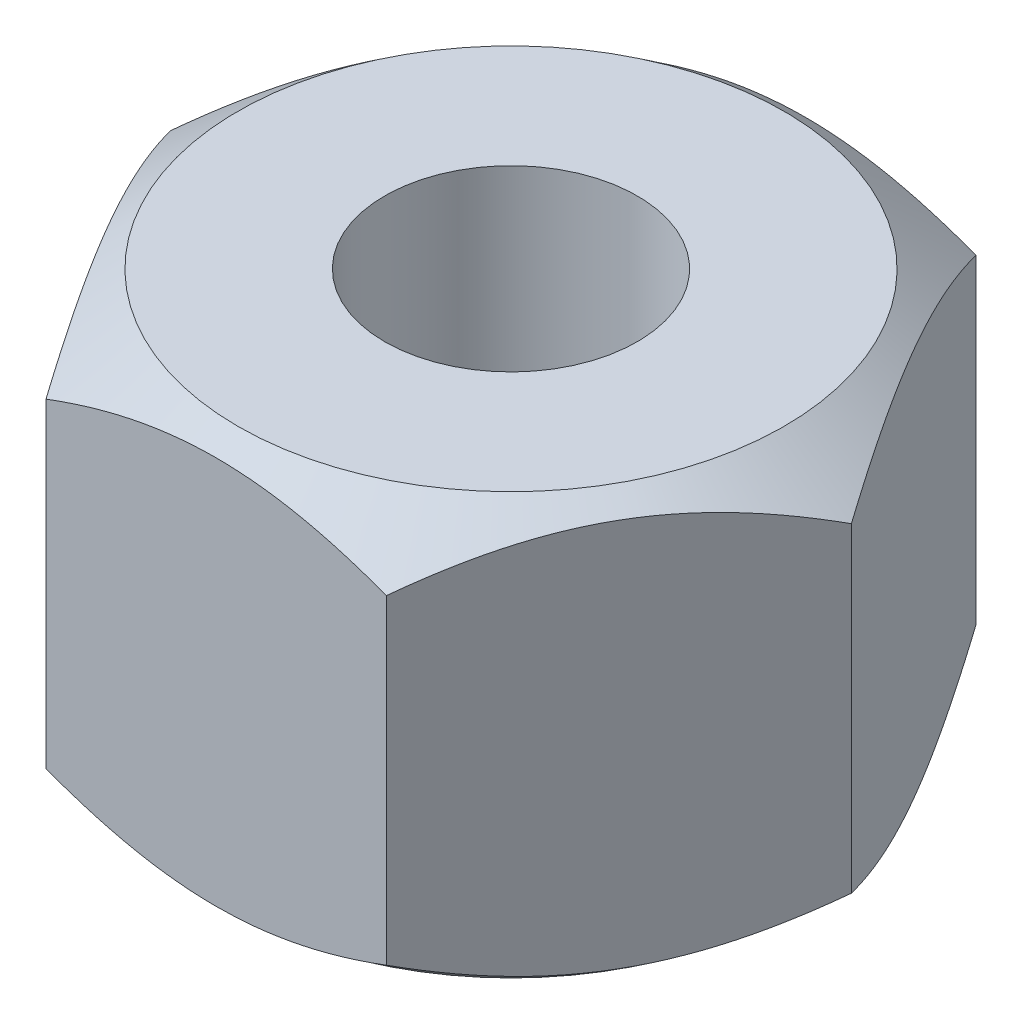
ISO-10303-21;
HEADER;
FILE_DESCRIPTION(('STEP AP214'),'2;1');
FILE_NAME('part.step','',(''),(''),'','','');
FILE_SCHEMA(('AUTOMOTIVE_DESIGN { 1 0 10303 214 1 1 1 1 }'));
ENDSEC;
DATA;
#1=APPLICATION_CONTEXT('core data for automotive mechanical design processes');
#2=APPLICATION_PROTOCOL_DEFINITION('international standard','automotive_design',2000,#1);
#3=PRODUCT_CONTEXT('',#1,'mechanical');
#4=PRODUCT('Part','Part','',(#3));
#5=PRODUCT_RELATED_PRODUCT_CATEGORY('part','',(#4));
#6=PRODUCT_DEFINITION_FORMATION('','',#4);
#7=PRODUCT_DEFINITION_CONTEXT('part definition',#1,'design');
#8=PRODUCT_DEFINITION('design','',#6,#7);
#9=PRODUCT_DEFINITION_SHAPE('','',#8);
#10=(LENGTH_UNIT() NAMED_UNIT(*) SI_UNIT(.MILLI.,.METRE.));
#11=(NAMED_UNIT(*) PLANE_ANGLE_UNIT() SI_UNIT($,.RADIAN.));
#12=(NAMED_UNIT(*) SI_UNIT($,.STERADIAN.) SOLID_ANGLE_UNIT());
#13=UNCERTAINTY_MEASURE_WITH_UNIT(LENGTH_MEASURE(1.E-05),#10,'distance_accuracy_value','');
#14=(GEOMETRIC_REPRESENTATION_CONTEXT(3) GLOBAL_UNCERTAINTY_ASSIGNED_CONTEXT((#13)) GLOBAL_UNIT_ASSIGNED_CONTEXT((#10,
#11,#12)) REPRESENTATION_CONTEXT('',''));
#15=CARTESIAN_POINT('',(0.,0.,0.));
#16=DIRECTION('',(0.,0.,1.));
#17=DIRECTION('',(1.,0.,0.));
#18=AXIS2_PLACEMENT_3D('',#15,#16,#17);
#19=CARTESIAN_POINT('',(0.,-2.5,0.));
#20=DIRECTION('',(0.,1.,0.));
#21=DIRECTION('',(0.,0.,1.));
#22=AXIS2_PLACEMENT_3D('',#19,#20,#21);
#23=PLANE('',#22);
#24=CARTESIAN_POINT('',(0.,-2.5,0.));
#25=DIRECTION('',(0.,1.,0.));
#26=DIRECTION('',(0.,0.,1.));
#27=AXIS2_PLACEMENT_3D('',#24,#25,#26);
#28=CIRCLE('',#27,1.5);
#29=CARTESIAN_POINT('',(0.,-2.5,1.5));
#30=VERTEX_POINT('',#29);
#31=EDGE_CURVE('E248',#30,#30,#28,.F.);
#32=ORIENTED_EDGE('',*,*,#31,.F.);
#33=EDGE_LOOP('',(#32));
#34=FACE_BOUND('',#33,.T.);
#35=CARTESIAN_POINT('',(0.,-2.5,0.));
#36=DIRECTION('',(0.,1.,0.));
#37=DIRECTION('',(0.,0.,1.));
#38=AXIS2_PLACEMENT_3D('',#35,#36,#37);
#39=CIRCLE('',#38,3.24145188432738);
#40=CARTESIAN_POINT('',(0.,-2.5,3.24145188432738));
#41=VERTEX_POINT('',#40);
#42=EDGE_CURVE('E245',#41,#41,#39,.T.);
#43=ORIENTED_EDGE('',*,*,#42,.F.);
#44=EDGE_LOOP('',(#43));
#45=FACE_BOUND('',#44,.T.);
#46=ADVANCED_FACE('F40',(#34,#45),#23,.F.);
#47=CARTESIAN_POINT('',(0.,-1.9,0.));
#48=DIRECTION('',(0.,1.,0.));
#49=DIRECTION('',(0.,0.,1.));
#50=AXIS2_PLACEMENT_3D('',#47,#48,#49);
#51=CONICAL_SURFACE('',#50,4.04145188432738,0.927295218001612);
#52=ORIENTED_EDGE('',*,*,#42,.T.);
#53=EDGE_LOOP('',(#52));
#54=FACE_BOUND('',#53,.T.);
#55=CARTESIAN_POINT('',(4.04156735438122,-1.89991339374819,-0.0002));
#56=CARTESIAN_POINT('',(3.96705352328257,-1.95578429172975,0.128861741329468));
#57=CARTESIAN_POINT('',(3.89170718034861,-2.00768611304092,0.259365435455606));
#58=CARTESIAN_POINT('',(3.7392034540274,-2.10126864761322,0.523509637787521));
#59=CARTESIAN_POINT('',(3.66204121099882,-2.14291741565108,0.657158563138993));
#60=CARTESIAN_POINT('',(3.50697167057246,-2.2129969923625,0.925746885863819));
#61=CARTESIAN_POINT('',(3.42907876228736,-2.24155155254781,1.0606613605629));
#62=CARTESIAN_POINT('',(3.27236621600757,-2.28377415555096,1.33209545290299));
#63=CARTESIAN_POINT('',(3.19354785928916,-2.29746077717566,1.46861285130837));
#64=CARTESIAN_POINT('',(3.03451864501044,-2.30882363873335,1.74405953032687));
#65=CARTESIAN_POINT('',(2.95430362822561,-2.306275348429,1.8829960149282));
#66=CARTESIAN_POINT('',(2.79438773424881,-2.28488588341954,2.15997846823382));
#67=CARTESIAN_POINT('',(2.71468718504672,-2.26603518450226,2.29802386884299));
#68=CARTESIAN_POINT('',(2.55654455522289,-2.21375559135922,2.57193493854041));
#69=CARTESIAN_POINT('',(2.47810216583927,-2.18033033239913,2.70780114241995));
#70=CARTESIAN_POINT('',(2.32280435113416,-2.10136257151254,2.97678484779362));
#71=CARTESIAN_POINT('',(2.24594851546372,-2.05582324619757,3.10990306003298));
#72=CARTESIAN_POINT('',(2.14483361687437,-1.98885412818209,3.28503920179193));
#73=CARTESIAN_POINT('',(2.11984045938448,-1.97171733053286,3.32832862040598));
#74=CARTESIAN_POINT('',(2.07007461227841,-1.93650570977334,3.4145255960754));
#75=CARTESIAN_POINT('',(2.04530158765677,-1.91843278203425,3.45743373337723));
#76=CARTESIAN_POINT('',(2.02061047210989,-1.89991339374819,3.50019999999998));
#77=B_SPLINE_CURVE_WITH_KNOTS('',3,(#55,#56,#57,#58,#59,#60,#61,#62,#63,#64,#65,#66,#67,#68,#69,
#70,#71,#72,#73,#74,#75,#76),.UNSPECIFIED.,.F.,.F.,(4,2,2,2,2,2,2,2,2,2,4),(0.,
0.477663661014633,0.956797250410974,1.43130424257629,1.90521761171161,2.38569933780832,
2.86646196127487,3.34710473885888,3.82762160390177,3.98614298547455,4.14435508331223),.UNSPECIFIED.);
#78=CARTESIAN_POINT('',(4.04145188432738,-1.9,0.));
#79=VERTEX_POINT('',#78);
#80=CARTESIAN_POINT('',(2.02072594216373,-1.9,3.49999999999998));
#81=VERTEX_POINT('',#80);
#82=EDGE_CURVE('E64',#79,#81,#77,.T.);
#83=ORIENTED_EDGE('',*,*,#82,.T.);
#84=CARTESIAN_POINT('',(6.10667352777562,0.347838263354341,3.49999999999994));
#85=CARTESIAN_POINT('',(5.99209018006754,0.273282731059147,3.49999999999994));
#86=CARTESIAN_POINT('',(5.87727314542573,0.199085559995702,3.49999999999994));
#87=CARTESIAN_POINT('',(5.64709281328175,0.0515351157174078,3.49999999999994));
#88=CARTESIAN_POINT('',(5.53172949732776,-0.0218181287008116,3.49999999999994));
#89=CARTESIAN_POINT('',(5.18451916250486,-0.240536035808811,3.49999999999995));
#90=CARTESIAN_POINT('',(4.95174402015018,-0.384433171225006,3.49999999999995));
#91=CARTESIAN_POINT('',(4.47589740098453,-0.671058295796416,3.49999999999995));
#92=CARTESIAN_POINT('',(4.23272628591245,-0.813622361980619,3.49999999999996));
#93=CARTESIAN_POINT('',(3.86446321148237,-1.02117988764172,3.49999999999996));
#94=CARTESIAN_POINT('',(3.74114067249787,-1.08930920658141,3.49999999999996));
#95=CARTESIAN_POINT('',(3.49311136018007,-1.22299435666472,3.49999999999996));
#96=CARTESIAN_POINT('',(3.36840462936568,-1.28855026657794,3.49999999999996));
#97=CARTESIAN_POINT('',(3.06073710910512,-1.44538737876057,3.49999999999997));
#98=CARTESIAN_POINT('',(2.87688028411739,-1.53492973097679,3.49999999999997));
#99=CARTESIAN_POINT('',(2.50491210074189,-1.70496939295996,3.49999999999997));
#100=CARTESIAN_POINT('',(2.3167995173247,-1.78546405748891,3.49999999999998));
#101=CARTESIAN_POINT('',(1.93743960991834,-1.93318600559833,3.49999999999998));
#102=CARTESIAN_POINT('',(1.74623994583251,-2.00053363668728,3.49999999999998));
#103=CARTESIAN_POINT('',(1.35869233291503,-2.11835768378597,3.49999999999999));
#104=CARTESIAN_POINT('',(1.16234841949176,-2.16884692086139,3.49999999999999));
#105=CARTESIAN_POINT('',(0.821309317937743,-2.23675350844189,3.49999999999999));
#106=CARTESIAN_POINT('',(0.677680209263062,-2.25948333912142,3.49999999999999));
#107=CARTESIAN_POINT('',(0.388963535625654,-2.292094475631,3.5));
#108=CARTESIAN_POINT('',(0.243876309108725,-2.30197869669561,3.5));
#109=CARTESIAN_POINT('',(-0.0464439502415812,-2.30811135745717,3.5));
#110=CARTESIAN_POINT('',(-0.191676680168744,-2.3043737948305,3.5));
#111=CARTESIAN_POINT('',(-0.481185084429847,-2.28360571299331,3.5));
#112=CARTESIAN_POINT('',(-0.625460580681061,-2.26657278659398,3.50000000000001));
#113=CARTESIAN_POINT('',(-0.964006261109216,-2.21209669144674,3.50000000000001));
#114=CARTESIAN_POINT('',(-1.15744031159053,-2.16949296811382,3.50000000000001));
#115=CARTESIAN_POINT('',(-1.53955903054103,-2.06649472930299,3.50000000000002));
#116=CARTESIAN_POINT('',(-1.72823861815143,-2.00608199028977,3.50000000000002));
#117=CARTESIAN_POINT('',(-2.00876759105231,-1.90510845558465,3.50000000000002));
#118=CARTESIAN_POINT('',(-2.10244189475048,-1.86946793350285,3.50000000000002));
#119=CARTESIAN_POINT('',(-2.28857408447079,-1.79528506525311,3.50000000000002));
#120=CARTESIAN_POINT('',(-2.38103263317638,-1.75674438406849,3.50000000000002));
#121=CARTESIAN_POINT('',(-2.65677895200489,-1.63741296739579,3.50000000000003));
#122=CARTESIAN_POINT('',(-2.83845853388943,-1.55290503333573,3.50000000000003));
#123=CARTESIAN_POINT('',(-3.15498710022954,-1.39785752111446,3.50000000000003));
#124=CARTESIAN_POINT('',(-3.29059598795561,-1.32884287029581,3.50000000000003));
#125=CARTESIAN_POINT('',(-3.56006787381905,-1.18748426466794,3.50000000000004));
#126=CARTESIAN_POINT('',(-3.69393085775791,-1.11514028280469,3.50000000000004));
#127=CARTESIAN_POINT('',(-3.96023259908417,-0.967754302050128,3.50000000000004));
#128=CARTESIAN_POINT('',(-4.09267071256729,-0.892711144860411,3.50000000000004));
#129=CARTESIAN_POINT('',(-4.35629625513862,-0.740457835667815,3.50000000000004));
#130=CARTESIAN_POINT('',(-4.48748366013631,-0.663247642037096,3.50000000000005));
#131=CARTESIAN_POINT('',(-4.74388638259076,-0.509987302519082,3.50000000000005));
#132=CARTESIAN_POINT('',(-4.86914088577593,-0.434002572851436,3.50000000000005));
#133=CARTESIAN_POINT('',(-5.11880795582155,-0.280661593633801,3.50000000000005));
#134=CARTESIAN_POINT('',(-5.24322051557169,-0.203305332521018,3.50000000000005));
#135=CARTESIAN_POINT('',(-5.49116630739236,-0.0475395209200145,3.50000000000006));
#136=CARTESIAN_POINT('',(-5.614700445245,0.0308685898548712,3.50000000000006));
#137=CARTESIAN_POINT('',(-5.8611362897761,0.18866183077601,3.50000000000006));
#138=CARTESIAN_POINT('',(-5.98403802226141,0.268046920598597,3.50000000000006));
#139=CARTESIAN_POINT('',(-6.10667352777555,0.347838263354341,3.50000000000006));
#140=B_SPLINE_CURVE_WITH_KNOTS('',3,(#84,#85,#86,#87,#88,#89,#90,#91,#92,#93,#94,#95,#96,#97,
#98,#99,#100,#101,#102,#103,#104,#105,#106,#107,#108,#109,#110,#111,#112,#113,#114,#115,#116,
#117,#118,#119,#120,#121,#122,#123,#124,#125,#126,#127,#128,#129,#130,#131,#132,#133,#134,#135,
#136,#137,#138,#139),.UNSPECIFIED.,.F.,.F.,(4,2,2,2,2,2,2,2,2,2,2,2,2,2,2,2,2,2,2,2,2,2,2,2,2,2,
2,4),(0.,0.410110361015052,0.820234674637756,1.64117234562427,2.48668291859003,2.90932860352625,
3.33196134157707,3.94528768297099,4.55879287637903,5.16638752992829,5.77351904037108,
6.20926530188629,6.64491265610514,7.08011246757504,7.51539109232134,8.10846225307891,
8.702142408377,9.0027794262623,9.30324514603197,9.9041090639837,10.3605472919859,
10.8169892296435,11.273629433789,11.730278415809,12.1697694579109,12.6092642069372,
13.0482088006013,13.4871353376993),.UNSPECIFIED.);
#141=CARTESIAN_POINT('',(-2.02072594216366,-1.9,3.50000000000002));
#142=VERTEX_POINT('',#141);
#143=EDGE_CURVE('E213',#81,#142,#140,.T.);
#144=ORIENTED_EDGE('',*,*,#143,.T.);
#145=CARTESIAN_POINT('',(-2.02061047210982,-1.89991339374819,3.50020000000002));
#146=CARTESIAN_POINT('',(-2.09512430320847,-1.95578429172975,3.37113825867055));
#147=CARTESIAN_POINT('',(-2.17047064614244,-2.00768611304092,3.24063456454442));
#148=CARTESIAN_POINT('',(-2.32297437246365,-2.10126864761322,2.9764903622125));
#149=CARTESIAN_POINT('',(-2.40013661549223,-2.14291741565108,2.84284143686103));
#150=CARTESIAN_POINT('',(-2.5552061559186,-2.2129969923625,2.57425311413621));
#151=CARTESIAN_POINT('',(-2.63309906420369,-2.24155155254781,2.43933863943712));
#152=CARTESIAN_POINT('',(-2.78981161048349,-2.28377415555097,2.16790454709704));
#153=CARTESIAN_POINT('',(-2.8686299672019,-2.29746077717567,2.03138714869166));
#154=CARTESIAN_POINT('',(-3.02765918148062,-2.30882363873336,1.75594046967316));
#155=CARTESIAN_POINT('',(-3.10787419826546,-2.30627534842901,1.61700398507184));
#156=CARTESIAN_POINT('',(-3.26779009224226,-2.28488588341956,1.34002153176622));
#157=CARTESIAN_POINT('',(-3.34749064144436,-2.26603518450227,1.20197613115705));
#158=CARTESIAN_POINT('',(-3.50563327126819,-2.21375559135923,0.928065061459629));
#159=CARTESIAN_POINT('',(-3.58407566065181,-2.18033033239914,0.792198857580084));
#160=CARTESIAN_POINT('',(-3.73937347535693,-2.10136257151256,0.523215152206417));
#161=CARTESIAN_POINT('',(-3.81622931102737,-2.05582324619759,0.390096939967057));
#162=CARTESIAN_POINT('',(-3.91734420961673,-1.98885412818211,0.214960798208109));
#163=CARTESIAN_POINT('',(-3.94233736710662,-1.97171733053287,0.171671379594053));
#164=CARTESIAN_POINT('',(-3.9921032142127,-1.93650570977334,0.0854744039246181));
#165=CARTESIAN_POINT('',(-4.01687623883434,-1.91843278203425,0.0425662666227808));
#166=CARTESIAN_POINT('',(-4.04156735438122,-1.89991339374819,-0.000199999999972163));
#167=B_SPLINE_CURVE_WITH_KNOTS('',3,(#145,#146,#147,#148,#149,#150,#151,#152,#153,#154,#155,
#156,#157,#158,#159,#160,#161,#162,#163,#164,#165,#166),.UNSPECIFIED.,.F.,.F.,(4,2,2,2,2,2,2,2,
2,2,4),(0.,0.477663661014635,0.956797250410977,1.4313042425763,1.90521761171161,
2.38569933780833,2.86646196127488,3.34710473885889,3.82762160390178,3.98614298547458,
4.14435508331228),.UNSPECIFIED.);
#168=CARTESIAN_POINT('',(-4.04145188432738,-1.9,0.));
#169=VERTEX_POINT('',#168);
#170=EDGE_CURVE('E207',#142,#169,#167,.T.);
#171=ORIENTED_EDGE('',*,*,#170,.T.);
#172=CARTESIAN_POINT('',(-4.04156735438122,-1.89991339374819,0.000200000000028221));
#173=CARTESIAN_POINT('',(-3.96705352328257,-1.95578429172975,-0.12886174132944));
#174=CARTESIAN_POINT('',(-3.89170718034861,-2.00768611304092,-0.259365435455578));
#175=CARTESIAN_POINT('',(-3.7392034540274,-2.10126864761322,-0.523509637787493));
#176=CARTESIAN_POINT('',(-3.66204121099882,-2.14291741565109,-0.657158563138965));
#177=CARTESIAN_POINT('',(-3.50697167057246,-2.2129969923625,-0.925746885863792));
#178=CARTESIAN_POINT('',(-3.42907876228736,-2.24155155254781,-1.06066136056288));
#179=CARTESIAN_POINT('',(-3.27236621600757,-2.28377415555097,-1.33209545290297));
#180=CARTESIAN_POINT('',(-3.19354785928916,-2.29746077717567,-1.46861285130834));
#181=CARTESIAN_POINT('',(-3.03451864501044,-2.30882363873336,-1.74405953032685));
#182=CARTESIAN_POINT('',(-2.95430362822561,-2.30627534842901,-1.88299601492817));
#183=CARTESIAN_POINT('',(-2.79438773424881,-2.28488588341956,-2.15997846823379));
#184=CARTESIAN_POINT('',(-2.71468718504671,-2.26603518450227,-2.29802386884296));
#185=CARTESIAN_POINT('',(-2.55654455522289,-2.21375559135923,-2.57193493854038));
#186=CARTESIAN_POINT('',(-2.47810216583926,-2.18033033239914,-2.70780114241993));
#187=CARTESIAN_POINT('',(-2.32280435113416,-2.10136257151256,-2.9767848477936));
#188=CARTESIAN_POINT('',(-2.24594851546372,-2.05582324619759,-3.10990306003296));
#189=CARTESIAN_POINT('',(-2.14483361687436,-1.98885412818211,-3.28503920179191));
#190=CARTESIAN_POINT('',(-2.11984045938447,-1.97171733053287,-3.32832862040597));
#191=CARTESIAN_POINT('',(-2.07007461227839,-1.93650570977334,-3.4145255960754));
#192=CARTESIAN_POINT('',(-2.04530158765675,-1.91843278203425,-3.45743373337724));
#193=CARTESIAN_POINT('',(-2.02061047210987,-1.89991339374819,-3.50019999999999));
#194=B_SPLINE_CURVE_WITH_KNOTS('',3,(#172,#173,#174,#175,#176,#177,#178,#179,#180,#181,#182,
#183,#184,#185,#186,#187,#188,#189,#190,#191,#192,#193),.UNSPECIFIED.,.F.,.F.,(4,2,2,2,2,2,2,2,
2,2,4),(0.,0.477663661014634,0.956797250410977,1.4313042425763,1.90521761171161,
2.38569933780833,2.86646196127488,3.34710473885889,3.82762160390178,3.98614298547458,
4.14435508331229),.UNSPECIFIED.);
#195=CARTESIAN_POINT('',(-2.02072594216371,-1.9,-3.49999999999999));
#196=VERTEX_POINT('',#195);
#197=EDGE_CURVE('E193',#169,#196,#194,.T.);
#198=ORIENTED_EDGE('',*,*,#197,.T.);
#199=CARTESIAN_POINT('',(-6.1066735277756,0.347838263354341,-3.49999999999998));
#200=CARTESIAN_POINT('',(-5.99209018006752,0.273282731059147,-3.49999999999998));
#201=CARTESIAN_POINT('',(-5.8772731454257,0.199085559995701,-3.49999999999998));
#202=CARTESIAN_POINT('',(-5.64709281328173,0.0515351157174069,-3.49999999999998));
#203=CARTESIAN_POINT('',(-5.53172949732773,-0.0218181287008125,-3.49999999999998));
#204=CARTESIAN_POINT('',(-5.18451916250484,-0.240536035808811,-3.49999999999998));
#205=CARTESIAN_POINT('',(-4.95174402015016,-0.384433171225006,-3.49999999999998));
#206=CARTESIAN_POINT('',(-4.4758974009845,-0.671058295796415,-3.49999999999998));
#207=CARTESIAN_POINT('',(-4.23272628591243,-0.813622361980618,-3.49999999999998));
#208=CARTESIAN_POINT('',(-3.86446321148235,-1.02117988764172,-3.49999999999999));
#209=CARTESIAN_POINT('',(-3.74114067249784,-1.08930920658141,-3.49999999999999));
#210=CARTESIAN_POINT('',(-3.49311136018004,-1.22299435666472,-3.49999999999999));
#211=CARTESIAN_POINT('',(-3.36840462936566,-1.28855026657794,-3.49999999999999));
#212=CARTESIAN_POINT('',(-3.0607371091051,-1.44538737876057,-3.49999999999999));
#213=CARTESIAN_POINT('',(-2.87688028411737,-1.53492973097679,-3.49999999999999));
#214=CARTESIAN_POINT('',(-2.50491210074186,-1.70496939295996,-3.49999999999999));
#215=CARTESIAN_POINT('',(-2.31679951732467,-1.78546405748891,-3.49999999999999));
#216=CARTESIAN_POINT('',(-1.93743960991832,-1.93318600559833,-3.49999999999999));
#217=CARTESIAN_POINT('',(-1.74623994583249,-2.00053363668728,-3.49999999999999));
#218=CARTESIAN_POINT('',(-1.358692332915,-2.11835768378597,-3.49999999999999));
#219=CARTESIAN_POINT('',(-1.16234841949173,-2.16884692086139,-3.5));
#220=CARTESIAN_POINT('',(-0.821309317937719,-2.23675350844189,-3.5));
#221=CARTESIAN_POINT('',(-0.677680209263038,-2.25948333912142,-3.5));
#222=CARTESIAN_POINT('',(-0.388963535625629,-2.292094475631,-3.5));
#223=CARTESIAN_POINT('',(-0.2438763091087,-2.30197869669561,-3.5));
#224=CARTESIAN_POINT('',(0.0464439502416056,-2.30811135745717,-3.5));
#225=CARTESIAN_POINT('',(0.191676680168768,-2.3043737948305,-3.5));
#226=CARTESIAN_POINT('',(0.481185084429871,-2.28360571299331,-3.5));
#227=CARTESIAN_POINT('',(0.625460580681085,-2.26657278659398,-3.5));
#228=CARTESIAN_POINT('',(0.964006261109241,-2.21209669144674,-3.5));
#229=CARTESIAN_POINT('',(1.15744031159055,-2.16949296811382,-3.5));
#230=CARTESIAN_POINT('',(1.53955903054105,-2.06649472930299,-3.5));
#231=CARTESIAN_POINT('',(1.72823861815145,-2.00608199028977,-3.50000000000001));
#232=CARTESIAN_POINT('',(2.00876759105234,-1.90510845558465,-3.50000000000001));
#233=CARTESIAN_POINT('',(2.1024418947505,-1.86946793350285,-3.50000000000001));
#234=CARTESIAN_POINT('',(2.28857408447082,-1.79528506525311,-3.50000000000001));
#235=CARTESIAN_POINT('',(2.3810326331764,-1.75674438406849,-3.50000000000001));
#236=CARTESIAN_POINT('',(2.65677895200492,-1.63741296739579,-3.50000000000001));
#237=CARTESIAN_POINT('',(2.83845853388945,-1.55290503333573,-3.50000000000001));
#238=CARTESIAN_POINT('',(3.15498710022957,-1.39785752111445,-3.50000000000001));
#239=CARTESIAN_POINT('',(3.29059598795564,-1.32884287029581,-3.50000000000001));
#240=CARTESIAN_POINT('',(3.56006787381908,-1.18748426466794,-3.50000000000001));
#241=CARTESIAN_POINT('',(3.69393085775794,-1.11514028280469,-3.50000000000001));
#242=CARTESIAN_POINT('',(3.9602325990842,-0.967754302050126,-3.50000000000001));
#243=CARTESIAN_POINT('',(4.09267071256732,-0.892711144860408,-3.50000000000001));
#244=CARTESIAN_POINT('',(4.35629625513865,-0.740457835667814,-3.50000000000001));
#245=CARTESIAN_POINT('',(4.48748366013634,-0.663247642037094,-3.50000000000002));
#246=CARTESIAN_POINT('',(4.74388638259078,-0.50998730251908,-3.50000000000002));
#247=CARTESIAN_POINT('',(4.86914088577596,-0.434002572851433,-3.50000000000002));
#248=CARTESIAN_POINT('',(5.11880795582157,-0.280661593633799,-3.50000000000002));
#249=CARTESIAN_POINT('',(5.24322051557172,-0.203305332521016,-3.50000000000002));
#250=CARTESIAN_POINT('',(5.49116630739238,-0.0475395209200123,-3.50000000000002));
#251=CARTESIAN_POINT('',(5.61470044524503,0.030868589854873,-3.50000000000002));
#252=CARTESIAN_POINT('',(5.86113628977613,0.188661830776011,-3.50000000000002));
#253=CARTESIAN_POINT('',(5.98403802226143,0.268046920598598,-3.50000000000002));
#254=CARTESIAN_POINT('',(6.10667352777558,0.347838263354341,-3.50000000000002));
#255=B_SPLINE_CURVE_WITH_KNOTS('',3,(#199,#200,#201,#202,#203,#204,#205,#206,#207,#208,#209,
#210,#211,#212,#213,#214,#215,#216,#217,#218,#219,#220,#221,#222,#223,#224,#225,#226,#227,#228,
#229,#230,#231,#232,#233,#234,#235,#236,#237,#238,#239,#240,#241,#242,#243,#244,#245,#246,#247,
#248,#249,#250,#251,#252,#253,#254),.UNSPECIFIED.,.F.,.F.,(4,2,2,2,2,2,2,2,2,2,2,2,2,2,2,2,2,2,
2,2,2,2,2,2,2,2,2,4),(0.,0.410110361015052,0.820234674637756,1.64117234562426,2.48668291859003,
2.90932860352625,3.33196134157707,3.94528768297099,4.55879287637903,5.16638752992829,
5.77351904037108,6.20926530188628,6.64491265610514,7.08011246757503,7.51539109232134,
8.10846225307891,8.702142408377,9.0027794262623,9.30324514603197,9.9041090639837,
10.3605472919859,10.8169892296435,11.273629433789,11.730278415809,12.1697694579109,
12.6092642069372,13.0482088006013,13.4871353376993),.UNSPECIFIED.);
#256=CARTESIAN_POINT('',(2.02072594216368,-1.9,-3.50000000000001));
#257=VERTEX_POINT('',#256);
#258=EDGE_CURVE('E95',#196,#257,#255,.T.);
#259=ORIENTED_EDGE('',*,*,#258,.T.);
#260=CARTESIAN_POINT('',(2.02061047210985,-1.89991339374819,-3.50020000000001));
#261=CARTESIAN_POINT('',(2.0951243032085,-1.95578429172975,-3.37113825867054));
#262=CARTESIAN_POINT('',(2.17047064614246,-2.00768611304092,-3.2406345645444));
#263=CARTESIAN_POINT('',(2.32297437246367,-2.10126864761322,-2.97649036221249));
#264=CARTESIAN_POINT('',(2.40013661549225,-2.14291741565109,-2.84284143686102));
#265=CARTESIAN_POINT('',(2.55520615591862,-2.2129969923625,-2.57425311413619));
#266=CARTESIAN_POINT('',(2.63309906420371,-2.24155155254781,-2.43933863943711));
#267=CARTESIAN_POINT('',(2.7898116104835,-2.28377415555097,-2.16790454709702));
#268=CARTESIAN_POINT('',(2.86862996720191,-2.29746077717567,-2.03138714869164));
#269=CARTESIAN_POINT('',(3.02765918148064,-2.30882363873336,-1.75594046967314));
#270=CARTESIAN_POINT('',(3.10787419826547,-2.30627534842901,-1.61700398507182));
#271=CARTESIAN_POINT('',(3.26779009224227,-2.28488588341956,-1.3400215317662));
#272=CARTESIAN_POINT('',(3.34749064144437,-2.26603518450227,-1.20197613115702));
#273=CARTESIAN_POINT('',(3.50563327126819,-2.21375559135923,-0.928065061459603));
#274=CARTESIAN_POINT('',(3.58407566065182,-2.18033033239914,-0.792198857580058));
#275=CARTESIAN_POINT('',(3.73937347535693,-2.10136257151256,-0.52321515220639));
#276=CARTESIAN_POINT('',(3.81622931102737,-2.05582324619759,-0.390096939967029));
#277=CARTESIAN_POINT('',(3.91734420961673,-1.98885412818211,-0.214960798208081));
#278=CARTESIAN_POINT('',(3.94233736710662,-1.97171733053287,-0.171671379594025));
#279=CARTESIAN_POINT('',(3.9921032142127,-1.93650570977334,-0.0854744039245902));
#280=CARTESIAN_POINT('',(4.01687623883434,-1.91843278203425,-0.0425662666227526));
#281=CARTESIAN_POINT('',(4.04156735438122,-1.89991339374819,0.000200000000000429));
#282=B_SPLINE_CURVE_WITH_KNOTS('',3,(#260,#261,#262,#263,#264,#265,#266,#267,#268,#269,#270,
#271,#272,#273,#274,#275,#276,#277,#278,#279,#280,#281),.UNSPECIFIED.,.F.,.F.,(4,2,2,2,2,2,2,2,
2,2,4),(0.,0.477663661014635,0.956797250410977,1.4313042425763,1.90521761171162,
2.38569933780833,2.86646196127488,3.34710473885889,3.82762160390178,3.98614298547458,
4.14435508331229),.UNSPECIFIED.);
#283=EDGE_CURVE('E92',#257,#79,#282,.T.);
#284=ORIENTED_EDGE('',*,*,#283,.T.);
#285=EDGE_LOOP('',(#83,#144,#171,#198,#259,#284));
#286=FACE_BOUND('',#285,.T.);
#287=ADVANCED_FACE('F93',(#54,#286),#51,.T.);
#288=CARTESIAN_POINT('',(2.02072594216373,2.5,3.49999999999998));
#289=DIRECTION('',(-0.866025403784442,0.,-0.499999999999995));
#290=DIRECTION('',(-0.499999999999995,0.,0.866025403784442));
#291=AXIS2_PLACEMENT_3D('',#288,#289,#290);
#292=PLANE('',#291);
#293=CARTESIAN_POINT('',(2.02061047210989,1.89991339374819,3.50019999999998));
#294=CARTESIAN_POINT('',(2.09512430320854,1.95578429172975,3.37113825867051));
#295=CARTESIAN_POINT('',(2.17047064614251,2.00768611304092,3.24063456454437));
#296=CARTESIAN_POINT('',(2.32297437246372,2.10126864761322,2.97649036221246));
#297=CARTESIAN_POINT('',(2.40013661549229,2.14291741565108,2.84284143686099));
#298=CARTESIAN_POINT('',(2.55520615591866,2.2129969923625,2.57425311413616));
#299=CARTESIAN_POINT('',(2.63309906420375,2.24155155254781,2.43933863943707));
#300=CARTESIAN_POINT('',(2.78981161048354,2.28377415555096,2.16790454709698));
#301=CARTESIAN_POINT('',(2.86862996720195,2.29746077717566,2.03138714869161));
#302=CARTESIAN_POINT('',(3.02765918148067,2.30882363873335,1.75594046967311));
#303=CARTESIAN_POINT('',(3.1078741982655,2.306275348429,1.61700398507178));
#304=CARTESIAN_POINT('',(3.2677900922423,2.28488588341954,1.34002153176616));
#305=CARTESIAN_POINT('',(3.3474906414444,2.26603518450226,1.20197613115699));
#306=CARTESIAN_POINT('',(3.50563327126822,2.21375559135922,0.92806506145957));
#307=CARTESIAN_POINT('',(3.58407566065185,2.18033033239912,0.792198857580025));
#308=CARTESIAN_POINT('',(3.73937347535696,2.10136257151254,0.523215152206356));
#309=CARTESIAN_POINT('',(3.81622931102739,2.05582324619757,0.390096939966995));
#310=CARTESIAN_POINT('',(3.91734420961675,1.98885412818209,0.214960798208052));
#311=CARTESIAN_POINT('',(3.94233736710663,1.97171733053286,0.171671379594002));
#312=CARTESIAN_POINT('',(3.9921032142127,1.93650570977334,0.0854744039245792));
#313=CARTESIAN_POINT('',(4.01687623883434,1.91843278203425,0.0425662666227472));
#314=CARTESIAN_POINT('',(4.04156735438122,1.89991339374819,-0.000200000000000632));
#315=B_SPLINE_CURVE_WITH_KNOTS('',3,(#293,#294,#295,#296,#297,#298,#299,#300,#301,#302,#303,
#304,#305,#306,#307,#308,#309,#310,#311,#312,#313,#314),.UNSPECIFIED.,.F.,.F.,(4,2,2,2,2,2,2,2,
2,2,4),(0.,0.477663661014633,0.956797250410975,1.4313042425763,1.90521761171161,
2.38569933780833,2.86646196127488,3.34710473885889,3.82762160390177,3.98614298547455,
4.14435508331223),.UNSPECIFIED.);
#316=CARTESIAN_POINT('',(2.02072594216373,1.9,3.49999999999998));
#317=VERTEX_POINT('',#316);
#318=CARTESIAN_POINT('',(4.04145188432738,1.9,0.));
#319=VERTEX_POINT('',#318);
#320=EDGE_CURVE('E125',#317,#319,#315,.T.);
#321=ORIENTED_EDGE('',*,*,#320,.F.);
#322=DIRECTION('',(0.,-1.,0.));
#323=VECTOR('',#322,1.);
#324=CARTESIAN_POINT('',(2.02072594216373,2.5,3.49999999999998));
#325=LINE('',#324,#323);
#326=EDGE_CURVE('E106',#317,#81,#325,.T.);
#327=ORIENTED_EDGE('',*,*,#326,.T.);
#328=ORIENTED_EDGE('',*,*,#82,.F.);
#329=DIRECTION('',(0.,-1.,0.));
#330=VECTOR('',#329,1.);
#331=CARTESIAN_POINT('',(4.04145188432738,2.5,0.));
#332=LINE('',#331,#330);
#333=EDGE_CURVE('E49',#319,#79,#332,.T.);
#334=ORIENTED_EDGE('',*,*,#333,.F.);
#335=EDGE_LOOP('',(#321,#327,#328,#334));
#336=FACE_BOUND('',#335,.T.);
#337=ADVANCED_FACE('F42',(#336),#292,.F.);
#338=CARTESIAN_POINT('',(4.04145188432738,2.5,0.));
#339=DIRECTION('',(-0.866025403784438,0.,0.500000000000001));
#340=DIRECTION('',(0.500000000000001,0.,0.866025403784438));
#341=AXIS2_PLACEMENT_3D('',#338,#339,#340);
#342=PLANE('',#341);
#343=CARTESIAN_POINT('',(4.04156735438122,1.89991339374819,0.000200000000000055));
#344=CARTESIAN_POINT('',(3.96705352328257,1.95578429172975,-0.128861741329467));
#345=CARTESIAN_POINT('',(3.8917071803486,2.00768611304092,-0.259365435455605));
#346=CARTESIAN_POINT('',(3.73920345402739,2.10126864761322,-0.523509637787519));
#347=CARTESIAN_POINT('',(3.66204121099882,2.14291741565109,-0.657158563138991));
#348=CARTESIAN_POINT('',(3.50697167057245,2.2129969923625,-0.925746885863816));
#349=CARTESIAN_POINT('',(3.42907876228736,2.24155155254781,-1.0606613605629));
#350=CARTESIAN_POINT('',(3.27236621600756,2.28377415555097,-1.33209545290299));
#351=CARTESIAN_POINT('',(3.19354785928915,2.29746077717567,-1.46861285130837));
#352=CARTESIAN_POINT('',(3.03451864501043,2.30882363873336,-1.74405953032687));
#353=CARTESIAN_POINT('',(2.9543036282256,2.30627534842901,-1.88299601492819));
#354=CARTESIAN_POINT('',(2.79438773424879,2.28488588341956,-2.15997846823381));
#355=CARTESIAN_POINT('',(2.7146871850467,2.26603518450227,-2.29802386884298));
#356=CARTESIAN_POINT('',(2.55654455522287,2.21375559135923,-2.5719349385404));
#357=CARTESIAN_POINT('',(2.47810216583925,2.18033033239914,-2.70780114241995));
#358=CARTESIAN_POINT('',(2.32280435113414,2.10136257151256,-2.97678484779361));
#359=CARTESIAN_POINT('',(2.2459485154637,2.05582324619759,-3.10990306003297));
#360=CARTESIAN_POINT('',(2.14483361687434,1.98885412818211,-3.28503920179192));
#361=CARTESIAN_POINT('',(2.11984045938445,1.97171733053287,-3.32832862040598));
#362=CARTESIAN_POINT('',(2.07007461227837,1.93650570977334,-3.41452559607542));
#363=CARTESIAN_POINT('',(2.04530158765673,1.91843278203425,-3.45743373337725));
#364=CARTESIAN_POINT('',(2.02061047210985,1.89991339374819,-3.50020000000001));
#365=B_SPLINE_CURVE_WITH_KNOTS('',3,(#343,#344,#345,#346,#347,#348,#349,#350,#351,#352,#353,
#354,#355,#356,#357,#358,#359,#360,#361,#362,#363,#364),.UNSPECIFIED.,.F.,.F.,(4,2,2,2,2,2,2,2,
2,2,4),(0.,0.477663661014634,0.956797250410977,1.4313042425763,1.90521761171161,
2.38569933780833,2.86646196127488,3.34710473885889,3.82762160390178,3.98614298547458,
4.14435508331229),.UNSPECIFIED.);
#366=CARTESIAN_POINT('',(2.02072594216368,1.9,-3.50000000000001));
#367=VERTEX_POINT('',#366);
#368=EDGE_CURVE('E111',#319,#367,#365,.T.);
#369=ORIENTED_EDGE('',*,*,#368,.F.);
#370=ORIENTED_EDGE('',*,*,#333,.T.);
#371=ORIENTED_EDGE('',*,*,#283,.F.);
#372=DIRECTION('',(0.,-1.,0.));
#373=VECTOR('',#372,1.);
#374=CARTESIAN_POINT('',(2.02072594216368,2.5,-3.50000000000001));
#375=LINE('',#374,#373);
#376=EDGE_CURVE('E112',#367,#257,#375,.T.);
#377=ORIENTED_EDGE('',*,*,#376,.F.);
#378=EDGE_LOOP('',(#369,#370,#371,#377));
#379=FACE_BOUND('',#378,.T.);
#380=ADVANCED_FACE('F110',(#379),#342,.F.);
#381=CARTESIAN_POINT('',(2.02072594216368,2.5,-3.50000000000001));
#382=DIRECTION('',(0.,0.,1.));
#383=DIRECTION('',(1.,0.,0.));
#384=AXIS2_PLACEMENT_3D('',#381,#382,#383);
#385=PLANE('',#384);
#386=CARTESIAN_POINT('',(6.10667352777558,-0.347838263354342,-3.50000000000002));
#387=CARTESIAN_POINT('',(5.99209018006749,-0.273282731059148,-3.50000000000002));
#388=CARTESIAN_POINT('',(5.87727314542568,-0.199085559995702,-3.50000000000002));
#389=CARTESIAN_POINT('',(5.6470928132817,-0.0515351157174082,-3.50000000000002));
#390=CARTESIAN_POINT('',(5.53172949732771,0.0218181287008108,-3.50000000000002));
#391=CARTESIAN_POINT('',(5.18451916250481,0.24053603580881,-3.50000000000002));
#392=CARTESIAN_POINT('',(4.95174402015014,0.384433171225005,-3.50000000000002));
#393=CARTESIAN_POINT('',(4.47589740098448,0.671058295796415,-3.50000000000002));
#394=CARTESIAN_POINT('',(4.2327262859124,0.813622361980617,-3.50000000000001));
#395=CARTESIAN_POINT('',(3.86446321148232,1.02117988764172,-3.50000000000001));
#396=CARTESIAN_POINT('',(3.74114067249782,1.08930920658141,-3.50000000000001));
#397=CARTESIAN_POINT('',(3.49311136018002,1.22299435666472,-3.50000000000001));
#398=CARTESIAN_POINT('',(3.36840462936564,1.28855026657794,-3.50000000000001));
#399=CARTESIAN_POINT('',(3.06073710910507,1.44538737876056,-3.50000000000001));
#400=CARTESIAN_POINT('',(2.87688028411734,1.53492973097679,-3.50000000000001));
#401=CARTESIAN_POINT('',(2.50491210074184,1.70496939295996,-3.50000000000001));
#402=CARTESIAN_POINT('',(2.31679951732465,1.78546405748891,-3.50000000000001));
#403=CARTESIAN_POINT('',(1.9374396099183,1.93318600559833,-3.50000000000001));
#404=CARTESIAN_POINT('',(1.74623994583246,2.00053363668728,-3.50000000000001));
#405=CARTESIAN_POINT('',(1.35869233291498,2.11835768378597,-3.5));
#406=CARTESIAN_POINT('',(1.16234841949171,2.16884692086139,-3.5));
#407=CARTESIAN_POINT('',(0.821309317937694,2.23675350844189,-3.5));
#408=CARTESIAN_POINT('',(0.677680209263013,2.25948333912142,-3.5));
#409=CARTESIAN_POINT('',(0.388963535625605,2.292094475631,-3.5));
#410=CARTESIAN_POINT('',(0.243876309108676,2.30197869669561,-3.5));
#411=CARTESIAN_POINT('',(-0.0464439502416299,2.30811135745717,-3.5));
#412=CARTESIAN_POINT('',(-0.191676680168792,2.3043737948305,-3.5));
#413=CARTESIAN_POINT('',(-0.481185084429895,2.28360571299331,-3.5));
#414=CARTESIAN_POINT('',(-0.62546058068111,2.26657278659398,-3.5));
#415=CARTESIAN_POINT('',(-0.964006261109265,2.21209669144674,-3.5));
#416=CARTESIAN_POINT('',(-1.15744031159058,2.16949296811382,-3.49999999999999));
#417=CARTESIAN_POINT('',(-1.53955903054108,2.06649472930299,-3.49999999999999));
#418=CARTESIAN_POINT('',(-1.72823861815148,2.00608199028977,-3.49999999999999));
#419=CARTESIAN_POINT('',(-2.00876759105236,1.90510845558465,-3.49999999999999));
#420=CARTESIAN_POINT('',(-2.10244189475053,1.86946793350285,-3.49999999999999));
#421=CARTESIAN_POINT('',(-2.28857408447084,1.79528506525311,-3.49999999999999));
#422=CARTESIAN_POINT('',(-2.38103263317643,1.75674438406849,-3.49999999999999));
#423=CARTESIAN_POINT('',(-2.65677895200494,1.63741296739579,-3.49999999999999));
#424=CARTESIAN_POINT('',(-2.83845853388947,1.55290503333573,-3.49999999999999));
#425=CARTESIAN_POINT('',(-3.15498710022959,1.39785752111446,-3.49999999999999));
#426=CARTESIAN_POINT('',(-3.29059598795566,1.32884287029581,-3.49999999999999));
#427=CARTESIAN_POINT('',(-3.5600678738191,1.18748426466794,-3.49999999999999));
#428=CARTESIAN_POINT('',(-3.69393085775796,1.11514028280469,-3.49999999999999));
#429=CARTESIAN_POINT('',(-3.96023259908423,0.967754302050126,-3.49999999999999));
#430=CARTESIAN_POINT('',(-4.09267071256734,0.892711144860408,-3.49999999999998));
#431=CARTESIAN_POINT('',(-4.35629625513867,0.740457835667814,-3.49999999999998));
#432=CARTESIAN_POINT('',(-4.48748366013636,0.663247642037094,-3.49999999999998));
#433=CARTESIAN_POINT('',(-4.7438863825908,0.509987302519081,-3.49999999999998));
#434=CARTESIAN_POINT('',(-4.86914088577598,0.434002572851435,-3.49999999999998));
#435=CARTESIAN_POINT('',(-5.1188079558216,0.2806615936338,-3.49999999999998));
#436=CARTESIAN_POINT('',(-5.24322051557174,0.203305332521017,-3.49999999999998));
#437=CARTESIAN_POINT('',(-5.49116630739241,0.0475395209200122,-3.49999999999998));
#438=CARTESIAN_POINT('',(-5.61470044524505,-0.0308685898548732,-3.49999999999998));
#439=CARTESIAN_POINT('',(-5.86113628977615,-0.188661830776011,-3.49999999999998));
#440=CARTESIAN_POINT('',(-5.98403802226146,-0.268046920598598,-3.49999999999998));
#441=CARTESIAN_POINT('',(-6.1066735277756,-0.347838263354342,-3.49999999999998));
#442=B_SPLINE_CURVE_WITH_KNOTS('',3,(#386,#387,#388,#389,#390,#391,#392,#393,#394,#395,#396,
#397,#398,#399,#400,#401,#402,#403,#404,#405,#406,#407,#408,#409,#410,#411,#412,#413,#414,#415,
#416,#417,#418,#419,#420,#421,#422,#423,#424,#425,#426,#427,#428,#429,#430,#431,#432,#433,#434,
#435,#436,#437,#438,#439,#440,#441),.UNSPECIFIED.,.F.,.F.,(4,2,2,2,2,2,2,2,2,2,2,2,2,2,2,2,2,2,
2,2,2,2,2,2,2,2,2,4),(0.,0.410110361015054,0.820234674637756,1.64117234562427,2.48668291859003,
2.90932860352625,3.33196134157707,3.94528768297099,4.55879287637903,5.16638752992829,
5.77351904037108,6.20926530188628,6.64491265610514,7.08011246757503,7.51539109232134,
8.10846225307891,8.702142408377,9.0027794262623,9.30324514603197,9.9041090639837,
10.3605472919859,10.8169892296435,11.273629433789,11.730278415809,12.1697694579109,
12.6092642069372,13.0482088006013,13.4871353376993),.UNSPECIFIED.);
#443=CARTESIAN_POINT('',(-2.02072594216371,1.9,-3.49999999999999));
#444=VERTEX_POINT('',#443);
#445=EDGE_CURVE('E173',#367,#444,#442,.T.);
#446=ORIENTED_EDGE('',*,*,#445,.F.);
#447=ORIENTED_EDGE('',*,*,#376,.T.);
#448=ORIENTED_EDGE('',*,*,#258,.F.);
#449=DIRECTION('',(0.,-1.,0.));
#450=VECTOR('',#449,1.);
#451=CARTESIAN_POINT('',(-2.02072594216371,2.5,-3.49999999999999));
#452=LINE('',#451,#450);
#453=EDGE_CURVE('E113',#444,#196,#452,.T.);
#454=ORIENTED_EDGE('',*,*,#453,.F.);
#455=EDGE_LOOP('',(#446,#447,#448,#454));
#456=FACE_BOUND('',#455,.T.);
#457=ADVANCED_FACE('F179',(#456),#385,.F.);
#458=CARTESIAN_POINT('',(-2.02072594216371,2.5,-3.49999999999999));
#459=DIRECTION('',(0.866025403784441,0.,0.499999999999995));
#460=DIRECTION('',(0.499999999999995,0.,-0.866025403784441));
#461=AXIS2_PLACEMENT_3D('',#458,#459,#460);
#462=PLANE('',#461);
#463=CARTESIAN_POINT('',(-3.03108891324554,0.,-1.74999999999998));
#464=DIRECTION('',(0.866025403784441,0.,0.499999999999995));
#465=DIRECTION('',(0.499999999999995,0.,-0.866025403784441));
#466=AXIS2_PLACEMENT_3D('',#463,#464,#465);
#467=CIRCLE('',#466,1.35);
#468=CARTESIAN_POINT('',(-2.35608891324555,0.,-2.91913429510898));
#469=VERTEX_POINT('',#468);
#470=EDGE_CURVE('E11',#469,#469,#467,.F.);
#471=ORIENTED_EDGE('',*,*,#470,.F.);
#472=EDGE_LOOP('',(#471));
#473=FACE_BOUND('',#472,.T.);
#474=CARTESIAN_POINT('',(-2.02061047210987,1.89991339374819,-3.50019999999999));
#475=CARTESIAN_POINT('',(-2.09512430320852,1.95578429172975,-3.37113825867052));
#476=CARTESIAN_POINT('',(-2.17047064614248,2.00768611304092,-3.24063456454439));
#477=CARTESIAN_POINT('',(-2.32297437246369,2.10126864761322,-2.97649036221247));
#478=CARTESIAN_POINT('',(-2.40013661549227,2.14291741565109,-2.842841436861));
#479=CARTESIAN_POINT('',(-2.55520615591863,2.2129969923625,-2.57425311413617));
#480=CARTESIAN_POINT('',(-2.63309906420373,2.24155155254781,-2.43933863943709));
#481=CARTESIAN_POINT('',(-2.78981161048352,2.28377415555097,-2.167904547097));
#482=CARTESIAN_POINT('',(-2.86862996720193,2.29746077717567,-2.03138714869162));
#483=CARTESIAN_POINT('',(-3.02765918148065,2.30882363873336,-1.75594046967312));
#484=CARTESIAN_POINT('',(-3.10787419826548,2.30627534842901,-1.61700398507179));
#485=CARTESIAN_POINT('',(-3.26779009224228,2.28488588341956,-1.34002153176617));
#486=CARTESIAN_POINT('',(-3.34749064144438,2.26603518450227,-1.201976131157));
#487=CARTESIAN_POINT('',(-3.5056332712682,2.21375559135923,-0.92806506145958));
#488=CARTESIAN_POINT('',(-3.58407566065183,2.18033033239914,-0.792198857580034));
#489=CARTESIAN_POINT('',(-3.73937347535694,2.10136257151256,-0.523215152206365));
#490=CARTESIAN_POINT('',(-3.81622931102737,2.05582324619759,-0.390096939967004));
#491=CARTESIAN_POINT('',(-3.91734420961673,1.9888541281821,-0.214960798208054));
#492=CARTESIAN_POINT('',(-3.94233736710662,1.97171733053287,-0.171671379593997));
#493=CARTESIAN_POINT('',(-3.9921032142127,1.93650570977334,-0.0854744039245622));
#494=CARTESIAN_POINT('',(-4.01687623883434,1.91843278203425,-0.0425662666227246));
#495=CARTESIAN_POINT('',(-4.04156735438122,1.89991339374819,0.000200000000028593));
#496=B_SPLINE_CURVE_WITH_KNOTS('',3,(#474,#475,#476,#477,#478,#479,#480,#481,#482,#483,#484,
#485,#486,#487,#488,#489,#490,#491,#492,#493,#494,#495),.UNSPECIFIED.,.F.,.F.,(4,2,2,2,2,2,2,2,
2,2,4),(0.,0.477663661014634,0.956797250410976,1.4313042425763,1.90521761171162,
2.38569933780833,2.86646196127488,3.34710473885889,3.82762160390178,3.98614298547458,
4.14435508331228),.UNSPECIFIED.);
#497=CARTESIAN_POINT('',(-4.04145188432738,1.9,0.));
#498=VERTEX_POINT('',#497);
#499=EDGE_CURVE('E167',#444,#498,#496,.T.);
#500=ORIENTED_EDGE('',*,*,#499,.F.);
#501=ORIENTED_EDGE('',*,*,#453,.T.);
#502=ORIENTED_EDGE('',*,*,#197,.F.);
#503=DIRECTION('',(0.,-1.,0.));
#504=VECTOR('',#503,1.);
#505=CARTESIAN_POINT('',(-4.04145188432738,2.5,0.));
#506=LINE('',#505,#504);
#507=EDGE_CURVE('E118',#498,#169,#506,.T.);
#508=ORIENTED_EDGE('',*,*,#507,.F.);
#509=EDGE_LOOP('',(#500,#501,#502,#508));
#510=FACE_BOUND('',#509,.T.);
#511=ADVANCED_FACE('F182',(#473,#510),#462,.F.);
#512=CARTESIAN_POINT('',(-4.04145188432738,2.5,0.));
#513=DIRECTION('',(0.866025403784434,0.,-0.500000000000007));
#514=DIRECTION('',(-0.500000000000007,0.,-0.866025403784434));
#515=AXIS2_PLACEMENT_3D('',#512,#513,#514);
#516=PLANE('',#515);
#517=CARTESIAN_POINT('',(-4.04156735438122,1.89991339374819,-0.000199999999971833));
#518=CARTESIAN_POINT('',(-3.96705352328257,1.95578429172975,0.128861741329495));
#519=CARTESIAN_POINT('',(-3.8917071803486,2.00768611304092,0.259365435455632));
#520=CARTESIAN_POINT('',(-3.73920345402739,2.10126864761322,0.523509637787545));
#521=CARTESIAN_POINT('',(-3.66204121099881,2.14291741565109,0.657158563139016));
#522=CARTESIAN_POINT('',(-3.50697167057244,2.2129969923625,0.925746885863841));
#523=CARTESIAN_POINT('',(-3.42907876228735,2.24155155254781,1.06066136056292));
#524=CARTESIAN_POINT('',(-3.27236621600755,2.28377415555097,1.33209545290301));
#525=CARTESIAN_POINT('',(-3.19354785928914,2.29746077717567,1.46861285130839));
#526=CARTESIAN_POINT('',(-3.03451864501042,2.30882363873336,1.74405953032689));
#527=CARTESIAN_POINT('',(-2.95430362822558,2.30627534842901,1.88299601492821));
#528=CARTESIAN_POINT('',(-2.79438773424878,2.28488588341956,2.15997846823383));
#529=CARTESIAN_POINT('',(-2.71468718504668,2.26603518450227,2.298023868843));
#530=CARTESIAN_POINT('',(-2.55654455522286,2.21375559135923,2.57193493854042));
#531=CARTESIAN_POINT('',(-2.47810216583923,2.18033033239914,2.70780114241996));
#532=CARTESIAN_POINT('',(-2.32280435113411,2.10136257151256,2.97678484779363));
#533=CARTESIAN_POINT('',(-2.24594851546368,2.05582324619759,3.10990306003299));
#534=CARTESIAN_POINT('',(-2.14483361687431,1.98885412818211,3.28503920179194));
#535=CARTESIAN_POINT('',(-2.11984045938442,1.97171733053287,3.328328620406));
#536=CARTESIAN_POINT('',(-2.07007461227834,1.93650570977334,3.41452559607543));
#537=CARTESIAN_POINT('',(-2.0453015876567,1.91843278203425,3.45743373337727));
#538=CARTESIAN_POINT('',(-2.02061047210982,1.89991339374819,3.50020000000002));
#539=B_SPLINE_CURVE_WITH_KNOTS('',3,(#517,#518,#519,#520,#521,#522,#523,#524,#525,#526,#527,
#528,#529,#530,#531,#532,#533,#534,#535,#536,#537,#538),.UNSPECIFIED.,.F.,.F.,(4,2,2,2,2,2,2,2,
2,2,4),(0.,0.477663661014634,0.956797250410977,1.4313042425763,1.90521761171161,
2.38569933780833,2.86646196127488,3.34710473885889,3.82762160390178,3.98614298547458,
4.14435508331229),.UNSPECIFIED.);
#540=CARTESIAN_POINT('',(-2.02072594216366,1.9,3.50000000000002));
#541=VERTEX_POINT('',#540);
#542=EDGE_CURVE('E56',#498,#541,#539,.T.);
#543=ORIENTED_EDGE('',*,*,#542,.F.);
#544=ORIENTED_EDGE('',*,*,#507,.T.);
#545=ORIENTED_EDGE('',*,*,#170,.F.);
#546=DIRECTION('',(0.,-1.,0.));
#547=VECTOR('',#546,1.);
#548=CARTESIAN_POINT('',(-2.02072594216366,2.5,3.50000000000002));
#549=LINE('',#548,#547);
#550=EDGE_CURVE('E121',#541,#142,#549,.T.);
#551=ORIENTED_EDGE('',*,*,#550,.F.);
#552=EDGE_LOOP('',(#543,#544,#545,#551));
#553=FACE_BOUND('',#552,.T.);
#554=ADVANCED_FACE('F219',(#553),#516,.F.);
#555=CARTESIAN_POINT('',(-2.02072594216366,2.5,3.50000000000002));
#556=DIRECTION('',(0.,0.,-1.));
#557=DIRECTION('',(-1.,0.,0.));
#558=AXIS2_PLACEMENT_3D('',#555,#556,#557);
#559=PLANE('',#558);
#560=CARTESIAN_POINT('',(-6.10667352777555,-0.347838263354342,3.50000000000006));
#561=CARTESIAN_POINT('',(-5.99209018006747,-0.273282731059148,3.50000000000006));
#562=CARTESIAN_POINT('',(-5.87727314542565,-0.199085559995703,3.50000000000006));
#563=CARTESIAN_POINT('',(-5.64709281328168,-0.0515351157174087,3.50000000000006));
#564=CARTESIAN_POINT('',(-5.53172949732769,0.0218181287008107,3.50000000000006));
#565=CARTESIAN_POINT('',(-5.18451916250479,0.24053603580881,3.50000000000005));
#566=CARTESIAN_POINT('',(-4.95174402015011,0.384433171225005,3.50000000000005));
#567=CARTESIAN_POINT('',(-4.47589740098445,0.671058295796414,3.50000000000005));
#568=CARTESIAN_POINT('',(-4.23272628591238,0.813622361980617,3.50000000000004));
#569=CARTESIAN_POINT('',(-3.8644632114823,1.02117988764172,3.50000000000004));
#570=CARTESIAN_POINT('',(-3.74114067249779,1.08930920658141,3.50000000000004));
#571=CARTESIAN_POINT('',(-3.49311136018,1.22299435666472,3.50000000000004));
#572=CARTESIAN_POINT('',(-3.36840462936561,1.28855026657794,3.50000000000003));
#573=CARTESIAN_POINT('',(-3.06073710910505,1.44538737876056,3.50000000000003));
#574=CARTESIAN_POINT('',(-2.87688028411732,1.53492973097679,3.50000000000003));
#575=CARTESIAN_POINT('',(-2.50491210074182,1.70496939295996,3.50000000000003));
#576=CARTESIAN_POINT('',(-2.31679951732463,1.78546405748891,3.50000000000002));
#577=CARTESIAN_POINT('',(-1.93743960991827,1.93318600559833,3.50000000000002));
#578=CARTESIAN_POINT('',(-1.74623994583244,2.00053363668728,3.50000000000002));
#579=CARTESIAN_POINT('',(-1.35869233291495,2.11835768378597,3.50000000000001));
#580=CARTESIAN_POINT('',(-1.16234841949169,2.16884692086139,3.50000000000001));
#581=CARTESIAN_POINT('',(-0.82130931793767,2.23675350844189,3.50000000000001));
#582=CARTESIAN_POINT('',(-0.677680209262989,2.25948333912142,3.50000000000001));
#583=CARTESIAN_POINT('',(-0.388963535625581,2.292094475631,3.5));
#584=CARTESIAN_POINT('',(-0.243876309108652,2.30197869669561,3.5));
#585=CARTESIAN_POINT('',(0.0464439502416541,2.30811135745717,3.5));
#586=CARTESIAN_POINT('',(0.191676680168817,2.3043737948305,3.5));
#587=CARTESIAN_POINT('',(0.48118508442992,2.28360571299331,3.49999999999999));
#588=CARTESIAN_POINT('',(0.625460580681134,2.26657278659398,3.49999999999999));
#589=CARTESIAN_POINT('',(0.964006261109288,2.21209669144674,3.49999999999999));
#590=CARTESIAN_POINT('',(1.1574403115906,2.16949296811382,3.49999999999999));
#591=CARTESIAN_POINT('',(1.5395590305411,2.06649472930299,3.49999999999998));
#592=CARTESIAN_POINT('',(1.7282386181515,2.00608199028977,3.49999999999998));
#593=CARTESIAN_POINT('',(2.00876759105238,1.90510845558465,3.49999999999998));
#594=CARTESIAN_POINT('',(2.10244189475055,1.86946793350285,3.49999999999998));
#595=CARTESIAN_POINT('',(2.28857408447086,1.79528506525311,3.49999999999998));
#596=CARTESIAN_POINT('',(2.38103263317645,1.75674438406849,3.49999999999997));
#597=CARTESIAN_POINT('',(2.65677895200496,1.63741296739579,3.49999999999997));
#598=CARTESIAN_POINT('',(2.8384585338895,1.55290503333573,3.49999999999997));
#599=CARTESIAN_POINT('',(3.15498710022962,1.39785752111446,3.49999999999997));
#600=CARTESIAN_POINT('',(3.29059598795569,1.32884287029581,3.49999999999996));
#601=CARTESIAN_POINT('',(3.56006787381912,1.18748426466794,3.49999999999996));
#602=CARTESIAN_POINT('',(3.69393085775799,1.11514028280469,3.49999999999996));
#603=CARTESIAN_POINT('',(3.96023259908425,0.967754302050126,3.49999999999996));
#604=CARTESIAN_POINT('',(4.09267071256737,0.892711144860409,3.49999999999996));
#605=CARTESIAN_POINT('',(4.35629625513869,0.740457835667814,3.49999999999995));
#606=CARTESIAN_POINT('',(4.48748366013638,0.663247642037094,3.49999999999995));
#607=CARTESIAN_POINT('',(4.74388638259083,0.50998730251908,3.49999999999995));
#608=CARTESIAN_POINT('',(4.86914088577601,0.434002572851434,3.49999999999995));
#609=CARTESIAN_POINT('',(5.11880795582162,0.280661593633799,3.49999999999995));
#610=CARTESIAN_POINT('',(5.24322051557176,0.203305332521016,3.49999999999994));
#611=CARTESIAN_POINT('',(5.49116630739243,0.0475395209200123,3.49999999999994));
#612=CARTESIAN_POINT('',(5.61470044524507,-0.030868589854873,3.49999999999994));
#613=CARTESIAN_POINT('',(5.86113628977618,-0.188661830776011,3.49999999999994));
#614=CARTESIAN_POINT('',(5.98403802226148,-0.268046920598598,3.49999999999994));
#615=CARTESIAN_POINT('',(6.10667352777562,-0.347838263354342,3.49999999999994));
#616=B_SPLINE_CURVE_WITH_KNOTS('',3,(#560,#561,#562,#563,#564,#565,#566,#567,#568,#569,#570,
#571,#572,#573,#574,#575,#576,#577,#578,#579,#580,#581,#582,#583,#584,#585,#586,#587,#588,#589,
#590,#591,#592,#593,#594,#595,#596,#597,#598,#599,#600,#601,#602,#603,#604,#605,#606,#607,#608,
#609,#610,#611,#612,#613,#614,#615),.UNSPECIFIED.,.F.,.F.,(4,2,2,2,2,2,2,2,2,2,2,2,2,2,2,2,2,2,
2,2,2,2,2,2,2,2,2,4),(0.,0.410110361015052,0.820234674637756,1.64117234562426,2.48668291859003,
2.90932860352625,3.33196134157707,3.94528768297099,4.55879287637903,5.16638752992829,
5.77351904037108,6.20926530188629,6.64491265610514,7.08011246757504,7.51539109232134,
8.10846225307891,8.702142408377,9.0027794262623,9.30324514603197,9.9041090639837,
10.3605472919859,10.8169892296435,11.273629433789,11.730278415809,12.1697694579109,
12.6092642069372,13.0482088006013,13.4871353376993),.UNSPECIFIED.);
#617=EDGE_CURVE('E107',#541,#317,#616,.T.);
#618=ORIENTED_EDGE('',*,*,#617,.F.);
#619=ORIENTED_EDGE('',*,*,#550,.T.);
#620=ORIENTED_EDGE('',*,*,#143,.F.);
#621=ORIENTED_EDGE('',*,*,#326,.F.);
#622=EDGE_LOOP('',(#618,#619,#620,#621));
#623=FACE_BOUND('',#622,.T.);
#624=ADVANCED_FACE('F143',(#623),#559,.F.);
#625=CARTESIAN_POINT('',(0.,2.5,0.));
#626=DIRECTION('',(0.,-1.,0.));
#627=DIRECTION('',(0.,0.,-1.));
#628=AXIS2_PLACEMENT_3D('',#625,#626,#627);
#629=CONICAL_SURFACE('',#628,3.24145188432738,0.927295218001612);
#630=CARTESIAN_POINT('',(0.,2.5,0.));
#631=DIRECTION('',(0.,1.,0.));
#632=DIRECTION('',(0.,0.,1.));
#633=AXIS2_PLACEMENT_3D('',#630,#631,#632);
#634=CIRCLE('',#633,3.24145188432738);
#635=CARTESIAN_POINT('',(0.,2.5,3.24145188432738));
#636=VERTEX_POINT('',#635);
#637=EDGE_CURVE('E244',#636,#636,#634,.T.);
#638=ORIENTED_EDGE('',*,*,#637,.F.);
#639=EDGE_LOOP('',(#638));
#640=FACE_BOUND('',#639,.T.);
#641=ORIENTED_EDGE('',*,*,#320,.T.);
#642=ORIENTED_EDGE('',*,*,#368,.T.);
#643=ORIENTED_EDGE('',*,*,#445,.T.);
#644=ORIENTED_EDGE('',*,*,#499,.T.);
#645=ORIENTED_EDGE('',*,*,#542,.T.);
#646=ORIENTED_EDGE('',*,*,#617,.T.);
#647=EDGE_LOOP('',(#641,#642,#643,#644,#645,#646));
#648=FACE_BOUND('',#647,.T.);
#649=ADVANCED_FACE('F137',(#640,#648),#629,.T.);
#650=CARTESIAN_POINT('',(0.,2.5,0.));
#651=DIRECTION('',(0.,1.,0.));
#652=DIRECTION('',(0.,0.,1.));
#653=AXIS2_PLACEMENT_3D('',#650,#651,#652);
#654=PLANE('',#653);
#655=CARTESIAN_POINT('',(0.,2.5,0.));
#656=DIRECTION('',(0.,1.,0.));
#657=DIRECTION('',(0.,0.,1.));
#658=AXIS2_PLACEMENT_3D('',#655,#656,#657);
#659=CIRCLE('',#658,1.5);
#660=CARTESIAN_POINT('',(0.,2.5,1.5));
#661=VERTEX_POINT('',#660);
#662=EDGE_CURVE('E241',#661,#661,#659,.T.);
#663=ORIENTED_EDGE('',*,*,#662,.F.);
#664=EDGE_LOOP('',(#663));
#665=FACE_BOUND('',#664,.T.);
#666=ORIENTED_EDGE('',*,*,#637,.T.);
#667=EDGE_LOOP('',(#666));
#668=FACE_BOUND('',#667,.T.);
#669=ADVANCED_FACE('F142',(#665,#668),#654,.T.);
#670=CARTESIAN_POINT('',(0.,-6.74264068711928,0.));
#671=DIRECTION('',(0.,1.,0.));
#672=DIRECTION('',(0.,0.,1.));
#673=AXIS2_PLACEMENT_3D('',#670,#671,#672);
#674=CYLINDRICAL_SURFACE('',#673,1.5);
#675=ORIENTED_EDGE('',*,*,#31,.T.);
#676=EDGE_LOOP('',(#675));
#677=FACE_BOUND('',#676,.T.);
#678=ORIENTED_EDGE('',*,*,#662,.T.);
#679=EDGE_LOOP('',(#678));
#680=FACE_BOUND('',#679,.T.);
#681=ADVANCED_FACE('F145',(#677,#680),#674,.F.);
#682=CARTESIAN_POINT('',(-3.55070415551621,0.,-2.04999999999998));
#683=DIRECTION('',(0.866025403784441,0.,0.499999999999995));
#684=DIRECTION('',(0.499999999999995,0.,-0.866025403784442));
#685=AXIS2_PLACEMENT_3D('',#682,#683,#684);
#686=CYLINDRICAL_SURFACE('',#685,1.35);
#687=CARTESIAN_POINT('',(-3.55070415551621,0.,-2.04999999999998));
#688=DIRECTION('',(-0.866025403784442,0.,-0.499999999999995));
#689=DIRECTION('',(-0.499999999999995,0.,0.866025403784442));
#690=AXIS2_PLACEMENT_3D('',#687,#688,#689);
#691=CIRCLE('',#690,1.35);
#692=CARTESIAN_POINT('',(-4.2257041555162,0.,-0.880865704890985));
#693=VERTEX_POINT('',#692);
#694=EDGE_CURVE('E253',#693,#693,#691,.T.);
#695=ORIENTED_EDGE('',*,*,#694,.F.);
#696=EDGE_LOOP('',(#695));
#697=FACE_BOUND('',#696,.T.);
#698=ORIENTED_EDGE('',*,*,#470,.T.);
#699=EDGE_LOOP('',(#698));
#700=FACE_BOUND('',#699,.T.);
#701=ADVANCED_FACE('F236',(#697,#700),#686,.T.);
#702=CARTESIAN_POINT('',(-3.55070415551621,0.,-2.04999999999998));
#703=DIRECTION('',(-0.866025403784442,0.,-0.499999999999995));
#704=DIRECTION('',(-0.499999999999995,0.,0.866025403784442));
#705=AXIS2_PLACEMENT_3D('',#702,#703,#704);
#706=PLANE('',#705);
#707=CARTESIAN_POINT('',(-3.55070415551621,0.,-2.04999999999998));
#708=DIRECTION('',(-0.866025403784441,0.,-0.499999999999995));
#709=DIRECTION('',(-0.499999999999995,0.,0.866025403784441));
#710=AXIS2_PLACEMENT_3D('',#707,#708,#709);
#711=CIRCLE('',#710,0.85);
#712=CARTESIAN_POINT('',(-3.97570415551621,0.,-1.31387840678321));
#713=VERTEX_POINT('',#712);
#714=EDGE_CURVE('E257',#713,#713,#711,.T.);
#715=ORIENTED_EDGE('',*,*,#714,.F.);
#716=EDGE_LOOP('',(#715));
#717=FACE_BOUND('',#716,.T.);
#718=ORIENTED_EDGE('',*,*,#694,.T.);
#719=EDGE_LOOP('',(#718));
#720=FACE_BOUND('',#719,.T.);
#721=ADVANCED_FACE('F268',(#717,#720),#706,.T.);
#722=CARTESIAN_POINT('',(-2.68467875173177,0.,-1.54999999999999));
#723=DIRECTION('',(-0.866025403784441,0.,-0.499999999999995));
#724=DIRECTION('',(-0.499999999999995,0.,0.866025403784441));
#725=AXIS2_PLACEMENT_3D('',#722,#723,#724);
#726=CYLINDRICAL_SURFACE('',#725,0.85);
#727=CARTESIAN_POINT('',(-2.68467875173177,0.,-1.54999999999999));
#728=DIRECTION('',(-0.866025403784441,0.,-0.499999999999995));
#729=DIRECTION('',(-0.499999999999995,0.,0.866025403784441));
#730=AXIS2_PLACEMENT_3D('',#727,#728,#729);
#731=CIRCLE('',#730,0.85);
#732=CARTESIAN_POINT('',(-3.10967875173177,0.,-0.81387840678321));
#733=VERTEX_POINT('',#732);
#734=EDGE_CURVE('E256',#733,#733,#731,.T.);
#735=ORIENTED_EDGE('',*,*,#734,.F.);
#736=EDGE_LOOP('',(#735));
#737=FACE_BOUND('',#736,.T.);
#738=ORIENTED_EDGE('',*,*,#714,.T.);
#739=EDGE_LOOP('',(#738));
#740=FACE_BOUND('',#739,.T.);
#741=ADVANCED_FACE('F265',(#737,#740),#726,.F.);
#742=CARTESIAN_POINT('',(-2.68467875173177,0.,-1.54999999999999));
#743=DIRECTION('',(-0.866025403784441,0.,-0.499999999999995));
#744=DIRECTION('',(-0.499999999999995,0.,0.866025403784441));
#745=AXIS2_PLACEMENT_3D('',#742,#743,#744);
#746=PLANE('',#745);
#747=ORIENTED_EDGE('',*,*,#734,.T.);
#748=EDGE_LOOP('',(#747));
#749=FACE_BOUND('',#748,.T.);
#750=ADVANCED_FACE('F263',(#749),#746,.T.);
#751=CLOSED_SHELL('',(#46,#287,#337,#380,#457,#511,#554,#624,#649,#669,#681,#701,#721,#741,#750));
#752=MANIFOLD_SOLID_BREP('B2',#751);
#753=ADVANCED_BREP_SHAPE_REPRESENTATION('',(#18,#752),#14);
#754=SHAPE_DEFINITION_REPRESENTATION(#9,#753);
ENDSEC;
END-ISO-10303-21;
